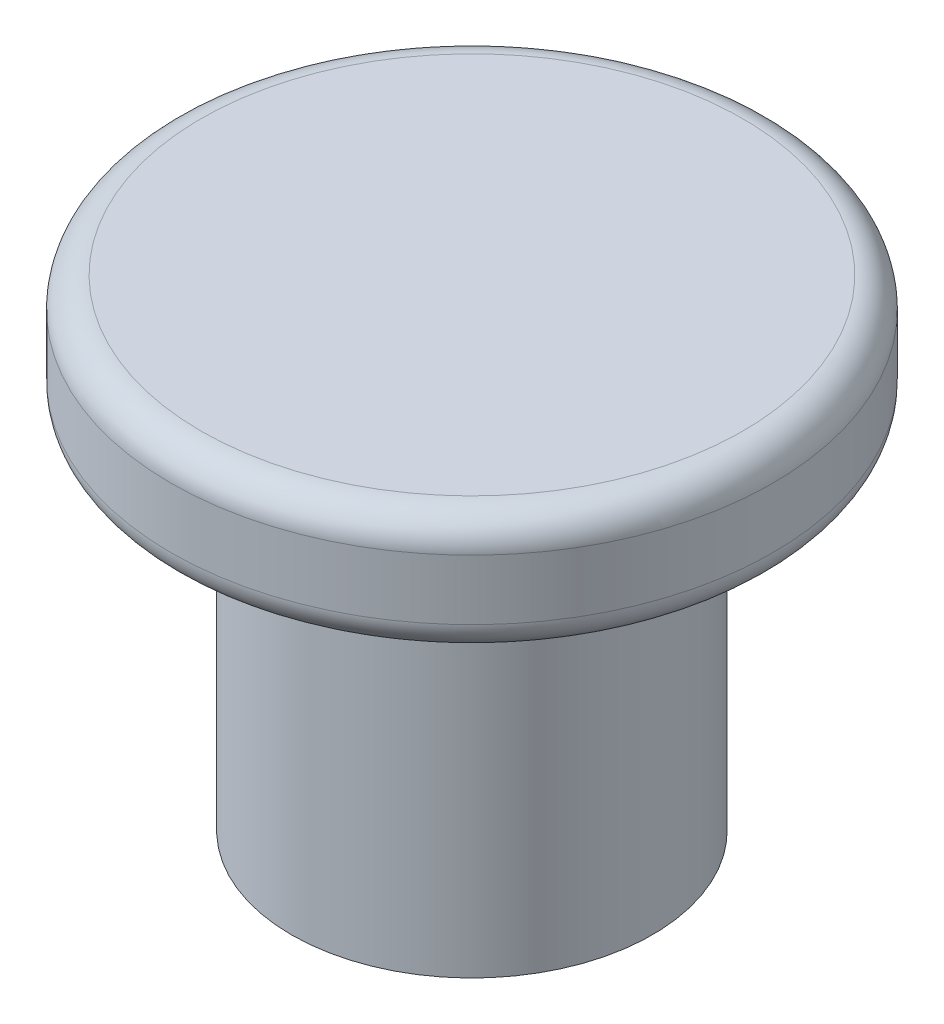
ISO-10303-21;
HEADER;
FILE_DESCRIPTION(('STEP AP214'),'2;1');
FILE_NAME('part.step','',(''),(''),'','','');
FILE_SCHEMA(('AUTOMOTIVE_DESIGN { 1 0 10303 214 1 1 1 1 }'));
ENDSEC;
DATA;
#1=APPLICATION_CONTEXT('core data for automotive mechanical design processes');
#2=APPLICATION_PROTOCOL_DEFINITION('international standard','automotive_design',2000,#1);
#3=PRODUCT_CONTEXT('',#1,'mechanical');
#4=PRODUCT('Part','Part','',(#3));
#5=PRODUCT_RELATED_PRODUCT_CATEGORY('part','',(#4));
#6=PRODUCT_DEFINITION_FORMATION('','',#4);
#7=PRODUCT_DEFINITION_CONTEXT('part definition',#1,'design');
#8=PRODUCT_DEFINITION('design','',#6,#7);
#9=PRODUCT_DEFINITION_SHAPE('','',#8);
#10=(LENGTH_UNIT() NAMED_UNIT(*) SI_UNIT(.MILLI.,.METRE.));
#11=(NAMED_UNIT(*) PLANE_ANGLE_UNIT() SI_UNIT($,.RADIAN.));
#12=(NAMED_UNIT(*) SI_UNIT($,.STERADIAN.) SOLID_ANGLE_UNIT());
#13=UNCERTAINTY_MEASURE_WITH_UNIT(LENGTH_MEASURE(1.E-05),#10,'distance_accuracy_value','');
#14=(GEOMETRIC_REPRESENTATION_CONTEXT(3) GLOBAL_UNCERTAINTY_ASSIGNED_CONTEXT((#13)) GLOBAL_UNIT_ASSIGNED_CONTEXT((#10,
#11,#12)) REPRESENTATION_CONTEXT('',''));
#15=CARTESIAN_POINT('',(0.,0.,0.));
#16=DIRECTION('',(0.,0.,1.));
#17=DIRECTION('',(1.,0.,0.));
#18=AXIS2_PLACEMENT_3D('',#15,#16,#17);
#19=CARTESIAN_POINT('',(0.,1.,0.));
#20=DIRECTION('',(0.,-1.,0.));
#21=DIRECTION('',(0.,0.,-1.));
#22=AXIS2_PLACEMENT_3D('',#19,#20,#21);
#23=CYLINDRICAL_SURFACE('',#22,2.5);
#24=CARTESIAN_POINT('',(0.,0.25,0.));
#25=DIRECTION('',(0.,1.,0.));
#26=DIRECTION('',(0.,0.,1.));
#27=AXIS2_PLACEMENT_3D('',#24,#25,#26);
#28=CIRCLE('',#27,2.5);
#29=CARTESIAN_POINT('',(0.,0.25,2.5));
#30=VERTEX_POINT('',#29);
#31=EDGE_CURVE('E66',#30,#30,#28,.T.);
#32=ORIENTED_EDGE('',*,*,#31,.T.);
#33=EDGE_LOOP('',(#32));
#34=FACE_BOUND('',#33,.T.);
#35=CARTESIAN_POINT('',(0.,0.75,0.));
#36=DIRECTION('',(0.,1.,0.));
#37=DIRECTION('',(0.,0.,1.));
#38=AXIS2_PLACEMENT_3D('',#35,#36,#37);
#39=CIRCLE('',#38,2.5);
#40=CARTESIAN_POINT('',(0.,0.75,2.5));
#41=VERTEX_POINT('',#40);
#42=EDGE_CURVE('E64',#41,#41,#39,.F.);
#43=ORIENTED_EDGE('',*,*,#42,.T.);
#44=EDGE_LOOP('',(#43));
#45=FACE_BOUND('',#44,.T.);
#46=ADVANCED_FACE('F39',(#34,#45),#23,.T.);
#47=CARTESIAN_POINT('',(0.,1.,0.));
#48=DIRECTION('',(0.,1.,0.));
#49=DIRECTION('',(0.,0.,1.));
#50=AXIS2_PLACEMENT_3D('',#47,#48,#49);
#51=PLANE('',#50);
#52=CARTESIAN_POINT('',(0.,1.,0.));
#53=DIRECTION('',(0.,1.,0.));
#54=DIRECTION('',(0.,0.,1.));
#55=AXIS2_PLACEMENT_3D('',#52,#53,#54);
#56=CIRCLE('',#55,2.25);
#57=CARTESIAN_POINT('',(0.,1.,2.25));
#58=VERTEX_POINT('',#57);
#59=EDGE_CURVE('E71',#58,#58,#56,.T.);
#60=ORIENTED_EDGE('',*,*,#59,.T.);
#61=EDGE_LOOP('',(#60));
#62=FACE_BOUND('',#61,.T.);
#63=ADVANCED_FACE('F89',(#62),#51,.T.);
#64=CARTESIAN_POINT('',(0.,0.,0.));
#65=DIRECTION('',(0.,1.,0.));
#66=DIRECTION('',(0.,0.,1.));
#67=AXIS2_PLACEMENT_3D('',#64,#65,#66);
#68=PLANE('',#67);
#69=CARTESIAN_POINT('',(0.,0.,0.));
#70=DIRECTION('',(0.,1.,0.));
#71=DIRECTION('',(0.,0.,1.));
#72=AXIS2_PLACEMENT_3D('',#69,#70,#71);
#73=CIRCLE('',#72,1.5);
#74=CARTESIAN_POINT('',(0.,0.,1.5));
#75=VERTEX_POINT('',#74);
#76=EDGE_CURVE('E78',#75,#75,#73,.F.);
#77=ORIENTED_EDGE('',*,*,#76,.F.);
#78=EDGE_LOOP('',(#77));
#79=FACE_BOUND('',#78,.T.);
#80=CARTESIAN_POINT('',(0.,0.,0.));
#81=DIRECTION('',(0.,1.,0.));
#82=DIRECTION('',(0.,0.,1.));
#83=AXIS2_PLACEMENT_3D('',#80,#81,#82);
#84=CIRCLE('',#83,2.25);
#85=CARTESIAN_POINT('',(0.,0.,2.25));
#86=VERTEX_POINT('',#85);
#87=EDGE_CURVE('E67',#86,#86,#84,.F.);
#88=ORIENTED_EDGE('',*,*,#87,.T.);
#89=EDGE_LOOP('',(#88));
#90=FACE_BOUND('',#89,.T.);
#91=ADVANCED_FACE('F96',(#79,#90),#68,.F.);
#92=CARTESIAN_POINT('',(0.,0.25,0.));
#93=DIRECTION('',(0.,1.,0.));
#94=DIRECTION('',(0.,0.,1.));
#95=AXIS2_PLACEMENT_3D('',#92,#93,#94);
#96=TOROIDAL_SURFACE('',#95,2.25,0.25);
#97=ORIENTED_EDGE('',*,*,#87,.F.);
#98=EDGE_LOOP('',(#97));
#99=FACE_BOUND('',#98,.T.);
#100=ORIENTED_EDGE('',*,*,#31,.F.);
#101=EDGE_LOOP('',(#100));
#102=FACE_BOUND('',#101,.T.);
#103=ADVANCED_FACE('F105',(#99,#102),#96,.T.);
#104=CARTESIAN_POINT('',(0.,0.75,0.));
#105=DIRECTION('',(0.,1.,0.));
#106=DIRECTION('',(0.,0.,1.));
#107=AXIS2_PLACEMENT_3D('',#104,#105,#106);
#108=TOROIDAL_SURFACE('',#107,2.25,0.25);
#109=ORIENTED_EDGE('',*,*,#42,.F.);
#110=EDGE_LOOP('',(#109));
#111=FACE_BOUND('',#110,.T.);
#112=ORIENTED_EDGE('',*,*,#59,.F.);
#113=EDGE_LOOP('',(#112));
#114=FACE_BOUND('',#113,.T.);
#115=ADVANCED_FACE('F102',(#111,#114),#108,.T.);
#116=CARTESIAN_POINT('',(0.,-3.,0.));
#117=DIRECTION('',(0.,1.,0.));
#118=DIRECTION('',(0.,0.,1.));
#119=AXIS2_PLACEMENT_3D('',#116,#117,#118);
#120=CYLINDRICAL_SURFACE('',#119,1.5);
#121=CARTESIAN_POINT('',(0.,-3.,0.));
#122=DIRECTION('',(0.,-1.,0.));
#123=DIRECTION('',(0.,0.,-1.));
#124=AXIS2_PLACEMENT_3D('',#121,#122,#123);
#125=CIRCLE('',#124,1.5);
#126=CARTESIAN_POINT('',(0.,-3.,-1.5));
#127=VERTEX_POINT('',#126);
#128=EDGE_CURVE('E56',#127,#127,#125,.T.);
#129=ORIENTED_EDGE('',*,*,#128,.F.);
#130=EDGE_LOOP('',(#129));
#131=FACE_BOUND('',#130,.T.);
#132=ORIENTED_EDGE('',*,*,#76,.T.);
#133=EDGE_LOOP('',(#132));
#134=FACE_BOUND('',#133,.T.);
#135=ADVANCED_FACE('F110',(#131,#134),#120,.T.);
#136=CARTESIAN_POINT('',(0.,-3.,0.));
#137=DIRECTION('',(0.,-1.,0.));
#138=DIRECTION('',(0.,0.,-1.));
#139=AXIS2_PLACEMENT_3D('',#136,#137,#138);
#140=PLANE('',#139);
#141=CARTESIAN_POINT('',(0.,-3.,0.));
#142=DIRECTION('',(0.,-1.,0.));
#143=DIRECTION('',(0.,0.,-1.));
#144=AXIS2_PLACEMENT_3D('',#141,#142,#143);
#145=CIRCLE('',#144,1.15000003199999);
#146=CARTESIAN_POINT('',(0.,-3.,-1.15000003199999));
#147=VERTEX_POINT('',#146);
#148=EDGE_CURVE('E11',#147,#147,#145,.F.);
#149=ORIENTED_EDGE('',*,*,#148,.T.);
#150=EDGE_LOOP('',(#149));
#151=FACE_BOUND('',#150,.T.);
#152=ORIENTED_EDGE('',*,*,#128,.T.);
#153=EDGE_LOOP('',(#152));
#154=FACE_BOUND('',#153,.T.);
#155=ADVANCED_FACE('F52',(#151,#154),#140,.T.);
#156=CARTESIAN_POINT('',(0.,-1.25,0.));
#157=DIRECTION('',(0.,-1.,0.));
#158=DIRECTION('',(0.,0.,-1.));
#159=AXIS2_PLACEMENT_3D('',#156,#157,#158);
#160=CONICAL_SURFACE('',#159,1.000000032,1.02974425867665);
#161=CARTESIAN_POINT('',(0.,-0.6491393617449,0.));
#162=VERTEX_POINT('',#161);
#163=VERTEX_LOOP('',#162);
#164=FACE_BOUND('',#163,.T.);
#165=CARTESIAN_POINT('',(0.,-1.25,0.));
#166=DIRECTION('',(0.,-1.,0.));
#167=DIRECTION('',(0.,0.,-1.));
#168=AXIS2_PLACEMENT_3D('',#165,#166,#167);
#169=CIRCLE('',#168,1.000000032);
#170=CARTESIAN_POINT('',(0.,-1.25,-1.000000032));
#171=VERTEX_POINT('',#170);
#172=EDGE_CURVE('E60',#171,#171,#169,.T.);
#173=ORIENTED_EDGE('',*,*,#172,.T.);
#174=EDGE_LOOP('',(#173));
#175=FACE_BOUND('',#174,.T.);
#176=ADVANCED_FACE('F47',(#164,#175),#160,.F.);
#177=CARTESIAN_POINT('',(0.,-3.,0.));
#178=DIRECTION('',(0.,-1.,0.));
#179=DIRECTION('',(0.,0.,-1.));
#180=AXIS2_PLACEMENT_3D('',#177,#178,#179);
#181=CYLINDRICAL_SURFACE('',#180,1.00000003199999);
#182=CARTESIAN_POINT('',(0.,-2.85,0.));
#183=DIRECTION('',(0.,-1.,0.));
#184=DIRECTION('',(0.,0.,-1.));
#185=AXIS2_PLACEMENT_3D('',#182,#183,#184);
#186=CIRCLE('',#185,1.00000003199999);
#187=CARTESIAN_POINT('',(0.,-2.85,-1.00000003199999));
#188=VERTEX_POINT('',#187);
#189=EDGE_CURVE('E46',#188,#188,#186,.T.);
#190=ORIENTED_EDGE('',*,*,#189,.T.);
#191=EDGE_LOOP('',(#190));
#192=FACE_BOUND('',#191,.T.);
#193=ORIENTED_EDGE('',*,*,#172,.F.);
#194=EDGE_LOOP('',(#193));
#195=FACE_BOUND('',#194,.T.);
#196=ADVANCED_FACE('F55',(#192,#195),#181,.F.);
#197=CARTESIAN_POINT('',(0.,-2.85,0.));
#198=DIRECTION('',(0.,-1.,0.));
#199=DIRECTION('',(0.,0.,-1.));
#200=AXIS2_PLACEMENT_3D('',#197,#198,#199);
#201=TOROIDAL_SURFACE('',#200,1.15000003199999,0.15);
#202=ORIENTED_EDGE('',*,*,#148,.F.);
#203=EDGE_LOOP('',(#202));
#204=FACE_BOUND('',#203,.T.);
#205=ORIENTED_EDGE('',*,*,#189,.F.);
#206=EDGE_LOOP('',(#205));
#207=FACE_BOUND('',#206,.T.);
#208=ADVANCED_FACE('F41',(#204,#207),#201,.T.);
#209=CLOSED_SHELL('',(#46,#63,#91,#103,#115,#135,#155,#176,#196,#208));
#210=MANIFOLD_SOLID_BREP('B2',#209);
#211=ADVANCED_BREP_SHAPE_REPRESENTATION('',(#18,#210),#14);
#212=SHAPE_DEFINITION_REPRESENTATION(#9,#211);
ENDSEC;
END-ISO-10303-21;
